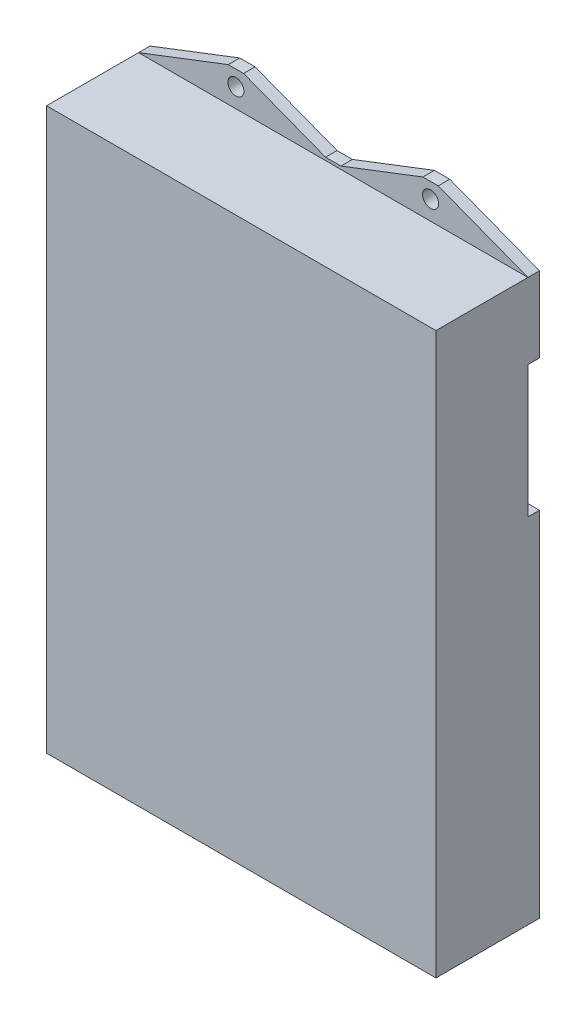
ISO-10303-21;
HEADER;
FILE_DESCRIPTION(('STEP AP214'),'2;1');
FILE_NAME('part.step','',(''),(''),'','','');
FILE_SCHEMA(('AUTOMOTIVE_DESIGN { 1 0 10303 214 1 1 1 1 }'));
ENDSEC;
DATA;
#1=APPLICATION_CONTEXT('core data for automotive mechanical design processes');
#2=APPLICATION_PROTOCOL_DEFINITION('international standard','automotive_design',2000,#1);
#3=PRODUCT_CONTEXT('',#1,'mechanical');
#4=PRODUCT('Part','Part','',(#3));
#5=PRODUCT_RELATED_PRODUCT_CATEGORY('part','',(#4));
#6=PRODUCT_DEFINITION_FORMATION('','',#4);
#7=PRODUCT_DEFINITION_CONTEXT('part definition',#1,'design');
#8=PRODUCT_DEFINITION('design','',#6,#7);
#9=PRODUCT_DEFINITION_SHAPE('','',#8);
#10=(LENGTH_UNIT() NAMED_UNIT(*) SI_UNIT(.MILLI.,.METRE.));
#11=(NAMED_UNIT(*) PLANE_ANGLE_UNIT() SI_UNIT($,.RADIAN.));
#12=(NAMED_UNIT(*) SI_UNIT($,.STERADIAN.) SOLID_ANGLE_UNIT());
#13=UNCERTAINTY_MEASURE_WITH_UNIT(LENGTH_MEASURE(1.E-05),#10,'distance_accuracy_value','');
#14=(GEOMETRIC_REPRESENTATION_CONTEXT(3) GLOBAL_UNCERTAINTY_ASSIGNED_CONTEXT((#13)) GLOBAL_UNIT_ASSIGNED_CONTEXT((#10,
#11,#12)) REPRESENTATION_CONTEXT('',''));
#15=CARTESIAN_POINT('',(0.,0.,0.));
#16=DIRECTION('',(0.,0.,1.));
#17=DIRECTION('',(1.,0.,0.));
#18=AXIS2_PLACEMENT_3D('',#15,#16,#17);
#19=CARTESIAN_POINT('',(0.,0.,3.));
#20=DIRECTION('',(0.,0.,1.));
#21=DIRECTION('',(1.,0.,0.));
#22=AXIS2_PLACEMENT_3D('',#19,#20,#21);
#23=PLANE('',#22);
#24=CARTESIAN_POINT('',(25.4,-78.15,3.));
#25=DIRECTION('',(0.,0.,1.));
#26=DIRECTION('',(-1.,0.,0.));
#27=AXIS2_PLACEMENT_3D('',#24,#25,#26);
#28=CIRCLE('',#27,2.1);
#29=CARTESIAN_POINT('',(23.3,-78.15,3.));
#30=VERTEX_POINT('',#29);
#31=EDGE_CURVE('E497',#30,#30,#28,.T.);
#32=ORIENTED_EDGE('',*,*,#31,.F.);
#33=EDGE_LOOP('',(#32));
#34=FACE_BOUND('',#33,.T.);
#35=CARTESIAN_POINT('',(-25.4,-78.15,3.));
#36=DIRECTION('',(0.,0.,1.));
#37=DIRECTION('',(1.,0.,0.));
#38=AXIS2_PLACEMENT_3D('',#35,#36,#37);
#39=CIRCLE('',#38,2.1);
#40=CARTESIAN_POINT('',(-23.3,-78.15,3.));
#41=VERTEX_POINT('',#40);
#42=EDGE_CURVE('E244',#41,#41,#39,.T.);
#43=ORIENTED_EDGE('',*,*,#42,.F.);
#44=EDGE_LOOP('',(#43));
#45=FACE_BOUND('',#44,.T.);
#46=DIRECTION('',(0.93334560620306,0.358979079308869,0.));
#47=VECTOR('',#46,1.);
#48=CARTESIAN_POINT('',(50.8,-73.15,3.));
#49=LINE('',#48,#47);
#50=CARTESIAN_POINT('',(27.4,-82.15,3.));
#51=VERTEX_POINT('',#50);
#52=CARTESIAN_POINT('',(50.8,-73.15,3.));
#53=VERTEX_POINT('',#52);
#54=EDGE_CURVE('E536',#51,#53,#49,.T.);
#55=ORIENTED_EDGE('',*,*,#54,.T.);
#56=DIRECTION('',(1.,0.,0.));
#57=VECTOR('',#56,1.);
#58=CARTESIAN_POINT('',(-50.8,-73.15,3.));
#59=LINE('',#58,#57);
#60=CARTESIAN_POINT('',(-50.8,-73.15,3.));
#61=VERTEX_POINT('',#60);
#62=EDGE_CURVE('E414',#61,#53,#59,.T.);
#63=ORIENTED_EDGE('',*,*,#62,.F.);
#64=DIRECTION('',(0.93334560620306,-0.358979079308869,0.));
#65=VECTOR('',#64,1.);
#66=CARTESIAN_POINT('',(-50.8,-73.15,3.));
#67=LINE('',#66,#65);
#68=CARTESIAN_POINT('',(-27.4,-82.15,3.));
#69=VERTEX_POINT('',#68);
#70=EDGE_CURVE('E518',#61,#69,#67,.T.);
#71=ORIENTED_EDGE('',*,*,#70,.T.);
#72=DIRECTION('',(1.,0.,0.));
#73=VECTOR('',#72,1.);
#74=CARTESIAN_POINT('',(-27.4,-82.15,3.));
#75=LINE('',#74,#73);
#76=CARTESIAN_POINT('',(-23.4,-82.15,3.));
#77=VERTEX_POINT('',#76);
#78=EDGE_CURVE('E521',#69,#77,#75,.T.);
#79=ORIENTED_EDGE('',*,*,#78,.T.);
#80=DIRECTION('',(0.933345606203059,0.35897907930887,0.));
#81=VECTOR('',#80,1.);
#82=CARTESIAN_POINT('',(-23.4,-82.15,3.));
#83=LINE('',#82,#81);
#84=CARTESIAN_POINT('',(-2.,-73.9192307692308,3.));
#85=VERTEX_POINT('',#84);
#86=EDGE_CURVE('E524',#77,#85,#83,.T.);
#87=ORIENTED_EDGE('',*,*,#86,.T.);
#88=DIRECTION('',(1.,0.,0.));
#89=VECTOR('',#88,1.);
#90=CARTESIAN_POINT('',(-2.,-73.9192307692308,3.));
#91=LINE('',#90,#89);
#92=CARTESIAN_POINT('',(2.,-73.9192307692308,3.));
#93=VERTEX_POINT('',#92);
#94=EDGE_CURVE('E527',#85,#93,#91,.T.);
#95=ORIENTED_EDGE('',*,*,#94,.T.);
#96=DIRECTION('',(0.933345606203059,-0.35897907930887,0.));
#97=VECTOR('',#96,1.);
#98=CARTESIAN_POINT('',(23.4,-82.15,3.));
#99=LINE('',#98,#97);
#100=CARTESIAN_POINT('',(23.4,-82.15,3.));
#101=VERTEX_POINT('',#100);
#102=EDGE_CURVE('E530',#93,#101,#99,.T.);
#103=ORIENTED_EDGE('',*,*,#102,.T.);
#104=DIRECTION('',(1.,0.,0.));
#105=VECTOR('',#104,1.);
#106=CARTESIAN_POINT('',(27.4,-82.15,3.));
#107=LINE('',#106,#105);
#108=EDGE_CURVE('E533',#101,#51,#107,.T.);
#109=ORIENTED_EDGE('',*,*,#108,.T.);
#110=EDGE_LOOP('',(#55,#63,#71,#79,#87,#95,#103,#109));
#111=FACE_BOUND('',#110,.T.);
#112=ADVANCED_FACE('F39',(#34,#45,#111),#23,.T.);
#113=CARTESIAN_POINT('',(25.4,78.15,3.));
#114=DIRECTION('',(0.,0.,1.));
#115=DIRECTION('',(1.,0.,0.));
#116=AXIS2_PLACEMENT_3D('',#113,#114,#115);
#117=CIRCLE('',#116,2.1);
#118=CARTESIAN_POINT('',(27.5,78.15,3.));
#119=VERTEX_POINT('',#118);
#120=EDGE_CURVE('E481',#119,#119,#117,.T.);
#121=ORIENTED_EDGE('',*,*,#120,.F.);
#122=EDGE_LOOP('',(#121));
#123=FACE_BOUND('',#122,.T.);
#124=CARTESIAN_POINT('',(-25.4,78.15,3.));
#125=DIRECTION('',(0.,0.,1.));
#126=DIRECTION('',(-1.,0.,0.));
#127=AXIS2_PLACEMENT_3D('',#124,#125,#126);
#128=CIRCLE('',#127,2.1);
#129=CARTESIAN_POINT('',(-27.5,78.15,3.));
#130=VERTEX_POINT('',#129);
#131=EDGE_CURVE('E489',#130,#130,#128,.T.);
#132=ORIENTED_EDGE('',*,*,#131,.F.);
#133=EDGE_LOOP('',(#132));
#134=FACE_BOUND('',#133,.T.);
#135=DIRECTION('',(-0.93334560620306,-0.358979079308869,0.));
#136=VECTOR('',#135,1.);
#137=CARTESIAN_POINT('',(-50.8,73.15,3.));
#138=LINE('',#137,#136);
#139=CARTESIAN_POINT('',(-27.4,82.15,3.));
#140=VERTEX_POINT('',#139);
#141=CARTESIAN_POINT('',(-50.8,73.15,3.));
#142=VERTEX_POINT('',#141);
#143=EDGE_CURVE('E57',#140,#142,#138,.T.);
#144=ORIENTED_EDGE('',*,*,#143,.T.);
#145=DIRECTION('',(-1.,0.,0.));
#146=VECTOR('',#145,1.);
#147=CARTESIAN_POINT('',(-50.8,73.15,3.));
#148=LINE('',#147,#146);
#149=CARTESIAN_POINT('',(50.8,73.15,3.));
#150=VERTEX_POINT('',#149);
#151=EDGE_CURVE('E427',#150,#142,#148,.T.);
#152=ORIENTED_EDGE('',*,*,#151,.F.);
#153=DIRECTION('',(-0.93334560620306,0.358979079308869,0.));
#154=VECTOR('',#153,1.);
#155=CARTESIAN_POINT('',(50.8,73.15,3.));
#156=LINE('',#155,#154);
#157=CARTESIAN_POINT('',(27.4,82.15,3.));
#158=VERTEX_POINT('',#157);
#159=EDGE_CURVE('E551',#150,#158,#156,.T.);
#160=ORIENTED_EDGE('',*,*,#159,.T.);
#161=DIRECTION('',(-1.,0.,0.));
#162=VECTOR('',#161,1.);
#163=CARTESIAN_POINT('',(27.4,82.15,3.));
#164=LINE('',#163,#162);
#165=CARTESIAN_POINT('',(23.4,82.15,3.));
#166=VERTEX_POINT('',#165);
#167=EDGE_CURVE('E554',#158,#166,#164,.T.);
#168=ORIENTED_EDGE('',*,*,#167,.T.);
#169=DIRECTION('',(-0.933345606203058,-0.358979079308872,0.));
#170=VECTOR('',#169,1.);
#171=CARTESIAN_POINT('',(23.4,82.15,3.));
#172=LINE('',#171,#170);
#173=CARTESIAN_POINT('',(2.,73.9192307692307,3.));
#174=VERTEX_POINT('',#173);
#175=EDGE_CURVE('E557',#166,#174,#172,.T.);
#176=ORIENTED_EDGE('',*,*,#175,.T.);
#177=DIRECTION('',(-1.,0.,0.));
#178=VECTOR('',#177,1.);
#179=CARTESIAN_POINT('',(-1.99999999999982,73.9192307692307,3.));
#180=LINE('',#179,#178);
#181=CARTESIAN_POINT('',(-1.99999999999982,73.9192307692307,3.));
#182=VERTEX_POINT('',#181);
#183=EDGE_CURVE('E217',#174,#182,#180,.T.);
#184=ORIENTED_EDGE('',*,*,#183,.T.);
#185=DIRECTION('',(-0.93334560620306,0.358979079308869,0.));
#186=VECTOR('',#185,1.);
#187=CARTESIAN_POINT('',(-23.4,82.15,3.));
#188=LINE('',#187,#186);
#189=CARTESIAN_POINT('',(-23.4,82.15,3.));
#190=VERTEX_POINT('',#189);
#191=EDGE_CURVE('E211',#182,#190,#188,.T.);
#192=ORIENTED_EDGE('',*,*,#191,.T.);
#193=DIRECTION('',(-1.,0.,0.));
#194=VECTOR('',#193,1.);
#195=CARTESIAN_POINT('',(-27.4,82.15,3.));
#196=LINE('',#195,#194);
#197=EDGE_CURVE('E215',#190,#140,#196,.T.);
#198=ORIENTED_EDGE('',*,*,#197,.T.);
#199=EDGE_LOOP('',(#144,#152,#160,#168,#176,#184,#192,#198));
#200=FACE_BOUND('',#199,.T.);
#201=ADVANCED_FACE('F213',(#123,#134,#200),#23,.T.);
#202=CARTESIAN_POINT('',(0.,0.,0.));
#203=DIRECTION('',(0.,0.,1.));
#204=DIRECTION('',(1.,0.,0.));
#205=AXIS2_PLACEMENT_3D('',#202,#203,#204);
#206=PLANE('',#205);
#207=DIRECTION('',(0.,-1.,0.));
#208=VECTOR('',#207,1.);
#209=CARTESIAN_POINT('',(-50.8,73.15,0.));
#210=LINE('',#209,#208);
#211=CARTESIAN_POINT('',(-50.8,73.15,0.));
#212=VERTEX_POINT('',#211);
#213=CARTESIAN_POINT('',(-50.8,53.45,0.));
#214=VERTEX_POINT('',#213);
#215=EDGE_CURVE('E239',#212,#214,#210,.T.);
#216=ORIENTED_EDGE('',*,*,#215,.F.);
#217=DIRECTION('',(-0.93334560620306,-0.358979079308869,0.));
#218=VECTOR('',#217,1.);
#219=CARTESIAN_POINT('',(-50.8,73.15,0.));
#220=LINE('',#219,#218);
#221=CARTESIAN_POINT('',(-27.4,82.15,0.));
#222=VERTEX_POINT('',#221);
#223=EDGE_CURVE('E141',#222,#212,#220,.T.);
#224=ORIENTED_EDGE('',*,*,#223,.F.);
#225=DIRECTION('',(-1.,0.,0.));
#226=VECTOR('',#225,1.);
#227=CARTESIAN_POINT('',(-27.4,82.15,0.));
#228=LINE('',#227,#226);
#229=CARTESIAN_POINT('',(-23.4,82.15,0.));
#230=VERTEX_POINT('',#229);
#231=EDGE_CURVE('E135',#230,#222,#228,.T.);
#232=ORIENTED_EDGE('',*,*,#231,.F.);
#233=DIRECTION('',(-0.93334560620306,0.358979079308869,0.));
#234=VECTOR('',#233,1.);
#235=CARTESIAN_POINT('',(-23.4,82.15,0.));
#236=LINE('',#235,#234);
#237=CARTESIAN_POINT('',(-1.99999999999982,73.9192307692307,0.));
#238=VERTEX_POINT('',#237);
#239=EDGE_CURVE('E226',#238,#230,#236,.T.);
#240=ORIENTED_EDGE('',*,*,#239,.F.);
#241=DIRECTION('',(-1.,0.,0.));
#242=VECTOR('',#241,1.);
#243=CARTESIAN_POINT('',(-1.99999999999982,73.9192307692307,0.));
#244=LINE('',#243,#242);
#245=CARTESIAN_POINT('',(2.,73.9192307692307,0.));
#246=VERTEX_POINT('',#245);
#247=EDGE_CURVE('E301',#246,#238,#244,.T.);
#248=ORIENTED_EDGE('',*,*,#247,.F.);
#249=DIRECTION('',(-0.933345606203058,-0.358979079308872,0.));
#250=VECTOR('',#249,1.);
#251=CARTESIAN_POINT('',(23.4,82.15,0.));
#252=LINE('',#251,#250);
#253=CARTESIAN_POINT('',(23.4,82.15,0.));
#254=VERTEX_POINT('',#253);
#255=EDGE_CURVE('E298',#254,#246,#252,.T.);
#256=ORIENTED_EDGE('',*,*,#255,.F.);
#257=DIRECTION('',(-1.,0.,0.));
#258=VECTOR('',#257,1.);
#259=CARTESIAN_POINT('',(27.4,82.15,0.));
#260=LINE('',#259,#258);
#261=CARTESIAN_POINT('',(27.4,82.15,0.));
#262=VERTEX_POINT('',#261);
#263=EDGE_CURVE('E295',#262,#254,#260,.T.);
#264=ORIENTED_EDGE('',*,*,#263,.F.);
#265=DIRECTION('',(-0.93334560620306,0.358979079308869,0.));
#266=VECTOR('',#265,1.);
#267=CARTESIAN_POINT('',(50.8,73.15,0.));
#268=LINE('',#267,#266);
#269=CARTESIAN_POINT('',(50.8,73.15,0.));
#270=VERTEX_POINT('',#269);
#271=EDGE_CURVE('E292',#270,#262,#268,.T.);
#272=ORIENTED_EDGE('',*,*,#271,.F.);
#273=DIRECTION('',(0.,1.,0.));
#274=VECTOR('',#273,1.);
#275=CARTESIAN_POINT('',(50.8,73.15,0.));
#276=LINE('',#275,#274);
#277=CARTESIAN_POINT('',(50.8,53.45,0.));
#278=VERTEX_POINT('',#277);
#279=EDGE_CURVE('E289',#278,#270,#276,.T.);
#280=ORIENTED_EDGE('',*,*,#279,.F.);
#281=DIRECTION('',(1.,0.,0.));
#282=VECTOR('',#281,1.);
#283=CARTESIAN_POINT('',(50.8,53.45,0.));
#284=LINE('',#283,#282);
#285=CARTESIAN_POINT('',(43.2,53.45,0.));
#286=VERTEX_POINT('',#285);
#287=EDGE_CURVE('E286',#286,#278,#284,.T.);
#288=ORIENTED_EDGE('',*,*,#287,.F.);
#289=DIRECTION('',(0.,1.,0.));
#290=VECTOR('',#289,1.);
#291=CARTESIAN_POINT('',(43.2,53.45,0.));
#292=LINE('',#291,#290);
#293=CARTESIAN_POINT('',(43.2,19.05,0.));
#294=VERTEX_POINT('',#293);
#295=EDGE_CURVE('E283',#294,#286,#292,.T.);
#296=ORIENTED_EDGE('',*,*,#295,.F.);
#297=DIRECTION('',(-1.,0.,0.));
#298=VECTOR('',#297,1.);
#299=CARTESIAN_POINT('',(43.2,19.05,0.));
#300=LINE('',#299,#298);
#301=CARTESIAN_POINT('',(50.8,19.05,0.));
#302=VERTEX_POINT('',#301);
#303=EDGE_CURVE('E280',#302,#294,#300,.T.);
#304=ORIENTED_EDGE('',*,*,#303,.F.);
#305=DIRECTION('',(0.,1.,0.));
#306=VECTOR('',#305,1.);
#307=CARTESIAN_POINT('',(50.8,19.05,0.));
#308=LINE('',#307,#306);
#309=CARTESIAN_POINT('',(50.8,-73.15,0.));
#310=VERTEX_POINT('',#309);
#311=EDGE_CURVE('E277',#310,#302,#308,.T.);
#312=ORIENTED_EDGE('',*,*,#311,.F.);
#313=DIRECTION('',(0.93334560620306,0.358979079308869,0.));
#314=VECTOR('',#313,1.);
#315=CARTESIAN_POINT('',(50.8,-73.15,0.));
#316=LINE('',#315,#314);
#317=CARTESIAN_POINT('',(27.4,-82.15,0.));
#318=VERTEX_POINT('',#317);
#319=EDGE_CURVE('E274',#318,#310,#316,.T.);
#320=ORIENTED_EDGE('',*,*,#319,.F.);
#321=DIRECTION('',(1.,0.,0.));
#322=VECTOR('',#321,1.);
#323=CARTESIAN_POINT('',(27.4,-82.15,0.));
#324=LINE('',#323,#322);
#325=CARTESIAN_POINT('',(23.4,-82.15,0.));
#326=VERTEX_POINT('',#325);
#327=EDGE_CURVE('E271',#326,#318,#324,.T.);
#328=ORIENTED_EDGE('',*,*,#327,.F.);
#329=DIRECTION('',(0.933345606203059,-0.35897907930887,0.));
#330=VECTOR('',#329,1.);
#331=CARTESIAN_POINT('',(23.4,-82.15,0.));
#332=LINE('',#331,#330);
#333=CARTESIAN_POINT('',(2.,-73.9192307692308,0.));
#334=VERTEX_POINT('',#333);
#335=EDGE_CURVE('E268',#334,#326,#332,.T.);
#336=ORIENTED_EDGE('',*,*,#335,.F.);
#337=DIRECTION('',(1.,0.,0.));
#338=VECTOR('',#337,1.);
#339=CARTESIAN_POINT('',(-2.,-73.9192307692308,0.));
#340=LINE('',#339,#338);
#341=CARTESIAN_POINT('',(-2.,-73.9192307692308,0.));
#342=VERTEX_POINT('',#341);
#343=EDGE_CURVE('E265',#342,#334,#340,.T.);
#344=ORIENTED_EDGE('',*,*,#343,.F.);
#345=DIRECTION('',(0.933345606203059,0.35897907930887,0.));
#346=VECTOR('',#345,1.);
#347=CARTESIAN_POINT('',(-23.4,-82.15,0.));
#348=LINE('',#347,#346);
#349=CARTESIAN_POINT('',(-23.4,-82.15,0.));
#350=VERTEX_POINT('',#349);
#351=EDGE_CURVE('E262',#350,#342,#348,.T.);
#352=ORIENTED_EDGE('',*,*,#351,.F.);
#353=DIRECTION('',(1.,0.,0.));
#354=VECTOR('',#353,1.);
#355=CARTESIAN_POINT('',(-27.4,-82.15,0.));
#356=LINE('',#355,#354);
#357=CARTESIAN_POINT('',(-27.4,-82.15,0.));
#358=VERTEX_POINT('',#357);
#359=EDGE_CURVE('E259',#358,#350,#356,.T.);
#360=ORIENTED_EDGE('',*,*,#359,.F.);
#361=DIRECTION('',(0.93334560620306,-0.358979079308869,0.));
#362=VECTOR('',#361,1.);
#363=CARTESIAN_POINT('',(-50.8,-73.15,0.));
#364=LINE('',#363,#362);
#365=CARTESIAN_POINT('',(-50.8,-73.15,0.));
#366=VERTEX_POINT('',#365);
#367=EDGE_CURVE('E256',#366,#358,#364,.T.);
#368=ORIENTED_EDGE('',*,*,#367,.F.);
#369=DIRECTION('',(0.,-1.,0.));
#370=VECTOR('',#369,1.);
#371=CARTESIAN_POINT('',(-50.8,19.05,0.));
#372=LINE('',#371,#370);
#373=CARTESIAN_POINT('',(-50.8,19.05,0.));
#374=VERTEX_POINT('',#373);
#375=EDGE_CURVE('E253',#374,#366,#372,.T.);
#376=ORIENTED_EDGE('',*,*,#375,.F.);
#377=DIRECTION('',(-1.,0.,0.));
#378=VECTOR('',#377,1.);
#379=CARTESIAN_POINT('',(-50.8,19.05,0.));
#380=LINE('',#379,#378);
#381=CARTESIAN_POINT('',(-43.2,19.05,0.));
#382=VERTEX_POINT('',#381);
#383=EDGE_CURVE('E250',#382,#374,#380,.T.);
#384=ORIENTED_EDGE('',*,*,#383,.F.);
#385=DIRECTION('',(0.,-1.,0.));
#386=VECTOR('',#385,1.);
#387=CARTESIAN_POINT('',(-43.2,53.45,0.));
#388=LINE('',#387,#386);
#389=CARTESIAN_POINT('',(-43.2,53.45,0.));
#390=VERTEX_POINT('',#389);
#391=EDGE_CURVE('E247',#390,#382,#388,.T.);
#392=ORIENTED_EDGE('',*,*,#391,.F.);
#393=DIRECTION('',(1.,0.,0.));
#394=VECTOR('',#393,1.);
#395=CARTESIAN_POINT('',(-50.8,53.45,0.));
#396=LINE('',#395,#394);
#397=EDGE_CURVE('E243',#214,#390,#396,.T.);
#398=ORIENTED_EDGE('',*,*,#397,.F.);
#399=EDGE_LOOP('',(#216,#224,#232,#240,#248,#256,#264,#272,#280,#288,#296,#304,#312,#320,#328,
#336,#344,#352,#360,#368,#376,#384,#392,#398));
#400=FACE_BOUND('',#399,.T.);
#401=CARTESIAN_POINT('',(-25.4,-78.15,0.));
#402=DIRECTION('',(0.,0.,1.));
#403=DIRECTION('',(1.,0.,0.));
#404=AXIS2_PLACEMENT_3D('',#401,#402,#403);
#405=CIRCLE('',#404,2.1);
#406=CARTESIAN_POINT('',(-23.3,-78.15,0.));
#407=VERTEX_POINT('',#406);
#408=EDGE_CURVE('E501',#407,#407,#405,.T.);
#409=ORIENTED_EDGE('',*,*,#408,.T.);
#410=EDGE_LOOP('',(#409));
#411=FACE_BOUND('',#410,.T.);
#412=CARTESIAN_POINT('',(25.4,-78.15,0.));
#413=DIRECTION('',(0.,0.,1.));
#414=DIRECTION('',(-1.,0.,0.));
#415=AXIS2_PLACEMENT_3D('',#412,#413,#414);
#416=CIRCLE('',#415,2.1);
#417=CARTESIAN_POINT('',(23.3,-78.15,0.));
#418=VERTEX_POINT('',#417);
#419=EDGE_CURVE('E493',#418,#418,#416,.T.);
#420=ORIENTED_EDGE('',*,*,#419,.T.);
#421=EDGE_LOOP('',(#420));
#422=FACE_BOUND('',#421,.T.);
#423=CARTESIAN_POINT('',(-25.4,78.15,0.));
#424=DIRECTION('',(0.,0.,1.));
#425=DIRECTION('',(-1.,0.,0.));
#426=AXIS2_PLACEMENT_3D('',#423,#424,#425);
#427=CIRCLE('',#426,2.1);
#428=CARTESIAN_POINT('',(-27.5,78.15,0.));
#429=VERTEX_POINT('',#428);
#430=EDGE_CURVE('E485',#429,#429,#427,.T.);
#431=ORIENTED_EDGE('',*,*,#430,.T.);
#432=EDGE_LOOP('',(#431));
#433=FACE_BOUND('',#432,.T.);
#434=CARTESIAN_POINT('',(25.4,78.15,0.));
#435=DIRECTION('',(0.,0.,1.));
#436=DIRECTION('',(1.,0.,0.));
#437=AXIS2_PLACEMENT_3D('',#434,#435,#436);
#438=CIRCLE('',#437,2.1);
#439=CARTESIAN_POINT('',(27.5,78.15,0.));
#440=VERTEX_POINT('',#439);
#441=EDGE_CURVE('E480',#440,#440,#438,.T.);
#442=ORIENTED_EDGE('',*,*,#441,.T.);
#443=EDGE_LOOP('',(#442));
#444=FACE_BOUND('',#443,.T.);
#445=CARTESIAN_POINT('',(-48.1,-69.85,0.));
#446=DIRECTION('',(0.,0.,1.));
#447=DIRECTION('',(1.,0.,0.));
#448=AXIS2_PLACEMENT_3D('',#445,#446,#447);
#449=CIRCLE('',#448,1.5);
#450=CARTESIAN_POINT('',(-46.6,-69.85,0.));
#451=VERTEX_POINT('',#450);
#452=EDGE_CURVE('E476',#451,#451,#449,.T.);
#453=ORIENTED_EDGE('',*,*,#452,.T.);
#454=EDGE_LOOP('',(#453));
#455=FACE_BOUND('',#454,.T.);
#456=CARTESIAN_POINT('',(48.1,-69.85,0.));
#457=DIRECTION('',(0.,0.,1.));
#458=DIRECTION('',(-1.,0.,0.));
#459=AXIS2_PLACEMENT_3D('',#456,#457,#458);
#460=CIRCLE('',#459,1.5);
#461=CARTESIAN_POINT('',(46.6,-69.85,0.));
#462=VERTEX_POINT('',#461);
#463=EDGE_CURVE('E472',#462,#462,#460,.T.);
#464=ORIENTED_EDGE('',*,*,#463,.T.);
#465=EDGE_LOOP('',(#464));
#466=FACE_BOUND('',#465,.T.);
#467=CARTESIAN_POINT('',(-48.1,69.85,0.));
#468=DIRECTION('',(0.,0.,1.));
#469=DIRECTION('',(-1.,0.,0.));
#470=AXIS2_PLACEMENT_3D('',#467,#468,#469);
#471=CIRCLE('',#470,1.5);
#472=CARTESIAN_POINT('',(-49.6,69.85,0.));
#473=VERTEX_POINT('',#472);
#474=EDGE_CURVE('E468',#473,#473,#471,.T.);
#475=ORIENTED_EDGE('',*,*,#474,.T.);
#476=EDGE_LOOP('',(#475));
#477=FACE_BOUND('',#476,.T.);
#478=CARTESIAN_POINT('',(48.1,69.85,0.));
#479=DIRECTION('',(0.,0.,1.));
#480=DIRECTION('',(1.,0.,0.));
#481=AXIS2_PLACEMENT_3D('',#478,#479,#480);
#482=CIRCLE('',#481,1.5);
#483=CARTESIAN_POINT('',(49.6,69.85,0.));
#484=VERTEX_POINT('',#483);
#485=EDGE_CURVE('E464',#484,#484,#482,.T.);
#486=ORIENTED_EDGE('',*,*,#485,.T.);
#487=EDGE_LOOP('',(#486));
#488=FACE_BOUND('',#487,.T.);
#489=ADVANCED_FACE('F398',(#400,#411,#422,#433,#444,#455,#466,#477,#488),#206,.F.);
#490=CARTESIAN_POINT('',(-50.8,53.45,3.));
#491=DIRECTION('',(0.,1.,0.));
#492=DIRECTION('',(0.,0.,1.));
#493=AXIS2_PLACEMENT_3D('',#490,#491,#492);
#494=PLANE('',#493);
#495=ORIENTED_EDGE('',*,*,#397,.T.);
#496=DIRECTION('',(0.,0.,-1.));
#497=VECTOR('',#496,1.);
#498=CARTESIAN_POINT('',(-43.2,53.45,3.));
#499=LINE('',#498,#497);
#500=CARTESIAN_POINT('',(-43.2,53.45,3.));
#501=VERTEX_POINT('',#500);
#502=EDGE_CURVE('E49',#501,#390,#499,.T.);
#503=ORIENTED_EDGE('',*,*,#502,.F.);
#504=DIRECTION('',(1.,0.,0.));
#505=VECTOR('',#504,1.);
#506=CARTESIAN_POINT('',(-50.8,53.45,3.));
#507=LINE('',#506,#505);
#508=CARTESIAN_POINT('',(-50.8,53.45,3.));
#509=VERTEX_POINT('',#508);
#510=EDGE_CURVE('E149',#509,#501,#507,.T.);
#511=ORIENTED_EDGE('',*,*,#510,.F.);
#512=DIRECTION('',(0.,0.,-1.));
#513=VECTOR('',#512,1.);
#514=CARTESIAN_POINT('',(-50.8,53.45,3.));
#515=LINE('',#514,#513);
#516=EDGE_CURVE('E11',#509,#214,#515,.T.);
#517=ORIENTED_EDGE('',*,*,#516,.T.);
#518=EDGE_LOOP('',(#495,#503,#511,#517));
#519=FACE_BOUND('',#518,.T.);
#520=ADVANCED_FACE('F41',(#519),#494,.F.);
#521=CARTESIAN_POINT('',(-43.2,53.45,3.));
#522=DIRECTION('',(1.,0.,0.));
#523=DIRECTION('',(0.,1.,0.));
#524=AXIS2_PLACEMENT_3D('',#521,#522,#523);
#525=PLANE('',#524);
#526=ORIENTED_EDGE('',*,*,#391,.T.);
#527=DIRECTION('',(0.,0.,-1.));
#528=VECTOR('',#527,1.);
#529=CARTESIAN_POINT('',(-43.2,19.05,3.));
#530=LINE('',#529,#528);
#531=CARTESIAN_POINT('',(-43.2,19.05,3.));
#532=VERTEX_POINT('',#531);
#533=EDGE_CURVE('E384',#532,#382,#530,.T.);
#534=ORIENTED_EDGE('',*,*,#533,.F.);
#535=DIRECTION('',(0.,-1.,0.));
#536=VECTOR('',#535,1.);
#537=CARTESIAN_POINT('',(-43.2,53.45,3.));
#538=LINE('',#537,#536);
#539=EDGE_CURVE('E394',#501,#532,#538,.T.);
#540=ORIENTED_EDGE('',*,*,#539,.F.);
#541=ORIENTED_EDGE('',*,*,#502,.T.);
#542=EDGE_LOOP('',(#526,#534,#540,#541));
#543=FACE_BOUND('',#542,.T.);
#544=ADVANCED_FACE('F392',(#543),#525,.F.);
#545=CARTESIAN_POINT('',(-50.8,19.05,3.));
#546=DIRECTION('',(0.,-1.,0.));
#547=DIRECTION('',(0.,0.,-1.));
#548=AXIS2_PLACEMENT_3D('',#545,#546,#547);
#549=PLANE('',#548);
#550=ORIENTED_EDGE('',*,*,#383,.T.);
#551=DIRECTION('',(0.,0.,-1.));
#552=VECTOR('',#551,1.);
#553=CARTESIAN_POINT('',(-50.8,19.05,3.));
#554=LINE('',#553,#552);
#555=CARTESIAN_POINT('',(-50.8,19.05,3.));
#556=VERTEX_POINT('',#555);
#557=EDGE_CURVE('E380',#556,#374,#554,.T.);
#558=ORIENTED_EDGE('',*,*,#557,.F.);
#559=DIRECTION('',(-1.,0.,0.));
#560=VECTOR('',#559,1.);
#561=CARTESIAN_POINT('',(-50.8,19.05,3.));
#562=LINE('',#561,#560);
#563=EDGE_CURVE('E515',#532,#556,#562,.T.);
#564=ORIENTED_EDGE('',*,*,#563,.F.);
#565=ORIENTED_EDGE('',*,*,#533,.T.);
#566=EDGE_LOOP('',(#550,#558,#564,#565));
#567=FACE_BOUND('',#566,.T.);
#568=ADVANCED_FACE('F403',(#567),#549,.F.);
#569=CARTESIAN_POINT('',(-50.8,19.05,3.));
#570=DIRECTION('',(1.,0.,0.));
#571=DIRECTION('',(0.,0.,-1.));
#572=AXIS2_PLACEMENT_3D('',#569,#570,#571);
#573=PLANE('',#572);
#574=ORIENTED_EDGE('',*,*,#375,.T.);
#575=DIRECTION('',(0.,0.,-1.));
#576=VECTOR('',#575,1.);
#577=CARTESIAN_POINT('',(-50.8,-73.15,3.));
#578=LINE('',#577,#576);
#579=EDGE_CURVE('E376',#61,#366,#578,.T.);
#580=ORIENTED_EDGE('',*,*,#579,.F.);
#581=DIRECTION('',(0.,0.,-1.));
#582=VECTOR('',#581,1.);
#583=CARTESIAN_POINT('',(-50.8,-73.15,27.));
#584=LINE('',#583,#582);
#585=CARTESIAN_POINT('',(-50.8,-73.15,27.));
#586=VERTEX_POINT('',#585);
#587=EDGE_CURVE('E444',#586,#61,#584,.T.);
#588=ORIENTED_EDGE('',*,*,#587,.F.);
#589=DIRECTION('',(0.,-1.,0.));
#590=VECTOR('',#589,1.);
#591=CARTESIAN_POINT('',(-50.8,73.15,27.));
#592=LINE('',#591,#590);
#593=CARTESIAN_POINT('',(-50.8,73.15,27.));
#594=VERTEX_POINT('',#593);
#595=EDGE_CURVE('E431',#594,#586,#592,.T.);
#596=ORIENTED_EDGE('',*,*,#595,.F.);
#597=DIRECTION('',(0.,0.,-1.));
#598=VECTOR('',#597,1.);
#599=CARTESIAN_POINT('',(-50.8,73.15,27.));
#600=LINE('',#599,#598);
#601=EDGE_CURVE('E432',#594,#142,#600,.T.);
#602=ORIENTED_EDGE('',*,*,#601,.T.);
#603=DIRECTION('',(0.,0.,-1.));
#604=VECTOR('',#603,1.);
#605=CARTESIAN_POINT('',(-50.8,73.15,3.));
#606=LINE('',#605,#604);
#607=EDGE_CURVE('E235',#142,#212,#606,.T.);
#608=ORIENTED_EDGE('',*,*,#607,.T.);
#609=ORIENTED_EDGE('',*,*,#215,.T.);
#610=ORIENTED_EDGE('',*,*,#516,.F.);
#611=DIRECTION('',(0.,-1.,0.));
#612=VECTOR('',#611,1.);
#613=CARTESIAN_POINT('',(-50.8,73.15,3.));
#614=LINE('',#613,#612);
#615=EDGE_CURVE('E411',#509,#556,#614,.T.);
#616=ORIENTED_EDGE('',*,*,#615,.T.);
#617=ORIENTED_EDGE('',*,*,#557,.T.);
#618=EDGE_LOOP('',(#574,#580,#588,#596,#602,#608,#609,#610,#616,#617));
#619=FACE_BOUND('',#618,.T.);
#620=ADVANCED_FACE('F408',(#619),#573,.F.);
#621=CARTESIAN_POINT('',(-50.8,-73.15,3.));
#622=DIRECTION('',(0.358979079308869,0.93334560620306,0.));
#623=DIRECTION('',(-0.93334560620306,0.358979079308869,0.));
#624=AXIS2_PLACEMENT_3D('',#621,#622,#623);
#625=PLANE('',#624);
#626=ORIENTED_EDGE('',*,*,#367,.T.);
#627=DIRECTION('',(0.,0.,-1.));
#628=VECTOR('',#627,1.);
#629=CARTESIAN_POINT('',(-27.4,-82.15,3.));
#630=LINE('',#629,#628);
#631=EDGE_CURVE('E372',#69,#358,#630,.T.);
#632=ORIENTED_EDGE('',*,*,#631,.F.);
#633=ORIENTED_EDGE('',*,*,#70,.F.);
#634=ORIENTED_EDGE('',*,*,#579,.T.);
#635=EDGE_LOOP('',(#626,#632,#633,#634));
#636=FACE_BOUND('',#635,.T.);
#637=ADVANCED_FACE('F752',(#636),#625,.F.);
#638=CARTESIAN_POINT('',(-27.4,-82.15,3.));
#639=DIRECTION('',(0.,1.,0.));
#640=DIRECTION('',(0.,0.,1.));
#641=AXIS2_PLACEMENT_3D('',#638,#639,#640);
#642=PLANE('',#641);
#643=ORIENTED_EDGE('',*,*,#359,.T.);
#644=DIRECTION('',(0.,0.,-1.));
#645=VECTOR('',#644,1.);
#646=CARTESIAN_POINT('',(-23.4,-82.15,3.));
#647=LINE('',#646,#645);
#648=EDGE_CURVE('E368',#77,#350,#647,.T.);
#649=ORIENTED_EDGE('',*,*,#648,.F.);
#650=ORIENTED_EDGE('',*,*,#78,.F.);
#651=ORIENTED_EDGE('',*,*,#631,.T.);
#652=EDGE_LOOP('',(#643,#649,#650,#651));
#653=FACE_BOUND('',#652,.T.);
#654=ADVANCED_FACE('F861',(#653),#642,.F.);
#655=CARTESIAN_POINT('',(-23.4,-82.15,3.));
#656=DIRECTION('',(-0.35897907930887,0.933345606203059,0.));
#657=DIRECTION('',(-0.933345606203059,-0.35897907930887,0.));
#658=AXIS2_PLACEMENT_3D('',#655,#656,#657);
#659=PLANE('',#658);
#660=ORIENTED_EDGE('',*,*,#351,.T.);
#661=DIRECTION('',(0.,0.,-1.));
#662=VECTOR('',#661,1.);
#663=CARTESIAN_POINT('',(-2.,-73.9192307692308,3.));
#664=LINE('',#663,#662);
#665=EDGE_CURVE('E364',#85,#342,#664,.T.);
#666=ORIENTED_EDGE('',*,*,#665,.F.);
#667=ORIENTED_EDGE('',*,*,#86,.F.);
#668=ORIENTED_EDGE('',*,*,#648,.T.);
#669=EDGE_LOOP('',(#660,#666,#667,#668));
#670=FACE_BOUND('',#669,.T.);
#671=ADVANCED_FACE('F870',(#670),#659,.F.);
#672=CARTESIAN_POINT('',(-2.,-73.9192307692308,3.));
#673=DIRECTION('',(0.,1.,0.));
#674=DIRECTION('',(0.,0.,1.));
#675=AXIS2_PLACEMENT_3D('',#672,#673,#674);
#676=PLANE('',#675);
#677=ORIENTED_EDGE('',*,*,#343,.T.);
#678=DIRECTION('',(0.,0.,-1.));
#679=VECTOR('',#678,1.);
#680=CARTESIAN_POINT('',(2.,-73.9192307692308,3.));
#681=LINE('',#680,#679);
#682=EDGE_CURVE('E360',#93,#334,#681,.T.);
#683=ORIENTED_EDGE('',*,*,#682,.F.);
#684=ORIENTED_EDGE('',*,*,#94,.F.);
#685=ORIENTED_EDGE('',*,*,#665,.T.);
#686=EDGE_LOOP('',(#677,#683,#684,#685));
#687=FACE_BOUND('',#686,.T.);
#688=ADVANCED_FACE('F880',(#687),#676,.F.);
#689=CARTESIAN_POINT('',(23.4,-82.15,3.));
#690=DIRECTION('',(0.35897907930887,0.933345606203059,0.));
#691=DIRECTION('',(-0.933345606203059,0.35897907930887,0.));
#692=AXIS2_PLACEMENT_3D('',#689,#690,#691);
#693=PLANE('',#692);
#694=ORIENTED_EDGE('',*,*,#335,.T.);
#695=DIRECTION('',(0.,0.,-1.));
#696=VECTOR('',#695,1.);
#697=CARTESIAN_POINT('',(23.4,-82.15,3.));
#698=LINE('',#697,#696);
#699=EDGE_CURVE('E356',#101,#326,#698,.T.);
#700=ORIENTED_EDGE('',*,*,#699,.F.);
#701=ORIENTED_EDGE('',*,*,#102,.F.);
#702=ORIENTED_EDGE('',*,*,#682,.T.);
#703=EDGE_LOOP('',(#694,#700,#701,#702));
#704=FACE_BOUND('',#703,.T.);
#705=ADVANCED_FACE('F889',(#704),#693,.F.);
#706=CARTESIAN_POINT('',(27.4,-82.15,3.));
#707=DIRECTION('',(0.,1.,0.));
#708=DIRECTION('',(0.,0.,1.));
#709=AXIS2_PLACEMENT_3D('',#706,#707,#708);
#710=PLANE('',#709);
#711=ORIENTED_EDGE('',*,*,#327,.T.);
#712=DIRECTION('',(0.,0.,-1.));
#713=VECTOR('',#712,1.);
#714=CARTESIAN_POINT('',(27.4,-82.15,3.));
#715=LINE('',#714,#713);
#716=EDGE_CURVE('E352',#51,#318,#715,.T.);
#717=ORIENTED_EDGE('',*,*,#716,.F.);
#718=ORIENTED_EDGE('',*,*,#108,.F.);
#719=ORIENTED_EDGE('',*,*,#699,.T.);
#720=EDGE_LOOP('',(#711,#717,#718,#719));
#721=FACE_BOUND('',#720,.T.);
#722=ADVANCED_FACE('F898',(#721),#710,.F.);
#723=CARTESIAN_POINT('',(50.8,-73.15,3.));
#724=DIRECTION('',(-0.358979079308869,0.93334560620306,0.));
#725=DIRECTION('',(-0.93334560620306,-0.358979079308869,0.));
#726=AXIS2_PLACEMENT_3D('',#723,#724,#725);
#727=PLANE('',#726);
#728=ORIENTED_EDGE('',*,*,#319,.T.);
#729=DIRECTION('',(0.,0.,-1.));
#730=VECTOR('',#729,1.);
#731=CARTESIAN_POINT('',(50.8,-73.15,3.));
#732=LINE('',#731,#730);
#733=EDGE_CURVE('E348',#53,#310,#732,.T.);
#734=ORIENTED_EDGE('',*,*,#733,.F.);
#735=ORIENTED_EDGE('',*,*,#54,.F.);
#736=ORIENTED_EDGE('',*,*,#716,.T.);
#737=EDGE_LOOP('',(#728,#734,#735,#736));
#738=FACE_BOUND('',#737,.T.);
#739=ADVANCED_FACE('F907',(#738),#727,.F.);
#740=CARTESIAN_POINT('',(43.2,19.05,3.));
#741=DIRECTION('',(0.,-1.,0.));
#742=DIRECTION('',(0.,0.,-1.));
#743=AXIS2_PLACEMENT_3D('',#740,#741,#742);
#744=PLANE('',#743);
#745=ORIENTED_EDGE('',*,*,#303,.T.);
#746=DIRECTION('',(0.,0.,-1.));
#747=VECTOR('',#746,1.);
#748=CARTESIAN_POINT('',(43.2,19.05,3.));
#749=LINE('',#748,#747);
#750=CARTESIAN_POINT('',(43.2,19.05,3.));
#751=VERTEX_POINT('',#750);
#752=EDGE_CURVE('E340',#751,#294,#749,.T.);
#753=ORIENTED_EDGE('',*,*,#752,.F.);
#754=DIRECTION('',(-1.,0.,0.));
#755=VECTOR('',#754,1.);
#756=CARTESIAN_POINT('',(43.2,19.05,3.));
#757=LINE('',#756,#755);
#758=CARTESIAN_POINT('',(50.8,19.05,3.));
#759=VERTEX_POINT('',#758);
#760=EDGE_CURVE('E539',#759,#751,#757,.T.);
#761=ORIENTED_EDGE('',*,*,#760,.F.);
#762=DIRECTION('',(0.,0.,-1.));
#763=VECTOR('',#762,1.);
#764=CARTESIAN_POINT('',(50.8,19.05,3.));
#765=LINE('',#764,#763);
#766=EDGE_CURVE('E344',#759,#302,#765,.T.);
#767=ORIENTED_EDGE('',*,*,#766,.T.);
#768=EDGE_LOOP('',(#745,#753,#761,#767));
#769=FACE_BOUND('',#768,.T.);
#770=ADVANCED_FACE('F916',(#769),#744,.F.);
#771=CARTESIAN_POINT('',(43.2,53.45,3.));
#772=DIRECTION('',(-1.,0.,0.));
#773=DIRECTION('',(0.,-1.,0.));
#774=AXIS2_PLACEMENT_3D('',#771,#772,#773);
#775=PLANE('',#774);
#776=ORIENTED_EDGE('',*,*,#295,.T.);
#777=DIRECTION('',(0.,0.,-1.));
#778=VECTOR('',#777,1.);
#779=CARTESIAN_POINT('',(43.2,53.45,3.));
#780=LINE('',#779,#778);
#781=CARTESIAN_POINT('',(43.2,53.45,3.));
#782=VERTEX_POINT('',#781);
#783=EDGE_CURVE('E336',#782,#286,#780,.T.);
#784=ORIENTED_EDGE('',*,*,#783,.F.);
#785=DIRECTION('',(0.,1.,0.));
#786=VECTOR('',#785,1.);
#787=CARTESIAN_POINT('',(43.2,53.45,3.));
#788=LINE('',#787,#786);
#789=EDGE_CURVE('E543',#751,#782,#788,.T.);
#790=ORIENTED_EDGE('',*,*,#789,.F.);
#791=ORIENTED_EDGE('',*,*,#752,.T.);
#792=EDGE_LOOP('',(#776,#784,#790,#791));
#793=FACE_BOUND('',#792,.T.);
#794=ADVANCED_FACE('F925',(#793),#775,.F.);
#795=CARTESIAN_POINT('',(50.8,53.45,3.));
#796=DIRECTION('',(0.,1.,0.));
#797=DIRECTION('',(0.,0.,1.));
#798=AXIS2_PLACEMENT_3D('',#795,#796,#797);
#799=PLANE('',#798);
#800=ORIENTED_EDGE('',*,*,#287,.T.);
#801=DIRECTION('',(0.,0.,-1.));
#802=VECTOR('',#801,1.);
#803=CARTESIAN_POINT('',(50.8,53.45,3.));
#804=LINE('',#803,#802);
#805=CARTESIAN_POINT('',(50.8,53.45,3.));
#806=VERTEX_POINT('',#805);
#807=EDGE_CURVE('E332',#806,#278,#804,.T.);
#808=ORIENTED_EDGE('',*,*,#807,.F.);
#809=DIRECTION('',(1.,0.,0.));
#810=VECTOR('',#809,1.);
#811=CARTESIAN_POINT('',(50.8,53.45,3.));
#812=LINE('',#811,#810);
#813=EDGE_CURVE('E547',#782,#806,#812,.T.);
#814=ORIENTED_EDGE('',*,*,#813,.F.);
#815=ORIENTED_EDGE('',*,*,#783,.T.);
#816=EDGE_LOOP('',(#800,#808,#814,#815));
#817=FACE_BOUND('',#816,.T.);
#818=ADVANCED_FACE('F624',(#817),#799,.F.);
#819=CARTESIAN_POINT('',(50.8,73.15,3.));
#820=DIRECTION('',(-1.,0.,0.));
#821=DIRECTION('',(0.,-1.,0.));
#822=AXIS2_PLACEMENT_3D('',#819,#820,#821);
#823=PLANE('',#822);
#824=ORIENTED_EDGE('',*,*,#279,.T.);
#825=DIRECTION('',(0.,0.,-1.));
#826=VECTOR('',#825,1.);
#827=CARTESIAN_POINT('',(50.8,73.15,3.));
#828=LINE('',#827,#826);
#829=EDGE_CURVE('E328',#150,#270,#828,.T.);
#830=ORIENTED_EDGE('',*,*,#829,.F.);
#831=DIRECTION('',(0.,0.,-1.));
#832=VECTOR('',#831,1.);
#833=CARTESIAN_POINT('',(50.8,73.15,27.));
#834=LINE('',#833,#832);
#835=CARTESIAN_POINT('',(50.8,73.15,27.));
#836=VERTEX_POINT('',#835);
#837=EDGE_CURVE('E436',#836,#150,#834,.T.);
#838=ORIENTED_EDGE('',*,*,#837,.F.);
#839=DIRECTION('',(0.,1.,0.));
#840=VECTOR('',#839,1.);
#841=CARTESIAN_POINT('',(50.8,73.15,27.));
#842=LINE('',#841,#840);
#843=CARTESIAN_POINT('',(50.8,-73.15,27.));
#844=VERTEX_POINT('',#843);
#845=EDGE_CURVE('E563',#844,#836,#842,.T.);
#846=ORIENTED_EDGE('',*,*,#845,.F.);
#847=DIRECTION('',(0.,0.,-1.));
#848=VECTOR('',#847,1.);
#849=CARTESIAN_POINT('',(50.8,-73.15,27.));
#850=LINE('',#849,#848);
#851=EDGE_CURVE('E440',#844,#53,#850,.T.);
#852=ORIENTED_EDGE('',*,*,#851,.T.);
#853=ORIENTED_EDGE('',*,*,#733,.T.);
#854=ORIENTED_EDGE('',*,*,#311,.T.);
#855=ORIENTED_EDGE('',*,*,#766,.F.);
#856=DIRECTION('',(0.,1.,0.));
#857=VECTOR('',#856,1.);
#858=CARTESIAN_POINT('',(50.8,73.15,3.));
#859=LINE('',#858,#857);
#860=EDGE_CURVE('E418',#759,#806,#859,.T.);
#861=ORIENTED_EDGE('',*,*,#860,.T.);
#862=ORIENTED_EDGE('',*,*,#807,.T.);
#863=EDGE_LOOP('',(#824,#830,#838,#846,#852,#853,#854,#855,#861,#862));
#864=FACE_BOUND('',#863,.T.);
#865=ADVANCED_FACE('F591',(#864),#823,.F.);
#866=CARTESIAN_POINT('',(50.8,73.15,3.));
#867=DIRECTION('',(-0.358979079308869,-0.93334560620306,0.));
#868=DIRECTION('',(0.93334560620306,-0.358979079308869,0.));
#869=AXIS2_PLACEMENT_3D('',#866,#867,#868);
#870=PLANE('',#869);
#871=ORIENTED_EDGE('',*,*,#271,.T.);
#872=DIRECTION('',(0.,0.,-1.));
#873=VECTOR('',#872,1.);
#874=CARTESIAN_POINT('',(27.4,82.15,3.));
#875=LINE('',#874,#873);
#876=EDGE_CURVE('E324',#158,#262,#875,.T.);
#877=ORIENTED_EDGE('',*,*,#876,.F.);
#878=ORIENTED_EDGE('',*,*,#159,.F.);
#879=ORIENTED_EDGE('',*,*,#829,.T.);
#880=EDGE_LOOP('',(#871,#877,#878,#879));
#881=FACE_BOUND('',#880,.T.);
#882=ADVANCED_FACE('F614',(#881),#870,.F.);
#883=CARTESIAN_POINT('',(27.4,82.15,3.));
#884=DIRECTION('',(0.,-1.,0.));
#885=DIRECTION('',(0.,0.,-1.));
#886=AXIS2_PLACEMENT_3D('',#883,#884,#885);
#887=PLANE('',#886);
#888=ORIENTED_EDGE('',*,*,#263,.T.);
#889=DIRECTION('',(0.,0.,-1.));
#890=VECTOR('',#889,1.);
#891=CARTESIAN_POINT('',(23.4,82.15,3.));
#892=LINE('',#891,#890);
#893=EDGE_CURVE('E320',#166,#254,#892,.T.);
#894=ORIENTED_EDGE('',*,*,#893,.F.);
#895=ORIENTED_EDGE('',*,*,#167,.F.);
#896=ORIENTED_EDGE('',*,*,#876,.T.);
#897=EDGE_LOOP('',(#888,#894,#895,#896));
#898=FACE_BOUND('',#897,.T.);
#899=ADVANCED_FACE('F608',(#898),#887,.F.);
#900=CARTESIAN_POINT('',(23.4,82.15,3.));
#901=DIRECTION('',(0.358979079308872,-0.933345606203058,0.));
#902=DIRECTION('',(0.933345606203058,0.358979079308872,0.));
#903=AXIS2_PLACEMENT_3D('',#900,#901,#902);
#904=PLANE('',#903);
#905=ORIENTED_EDGE('',*,*,#255,.T.);
#906=DIRECTION('',(0.,0.,-1.));
#907=VECTOR('',#906,1.);
#908=CARTESIAN_POINT('',(2.,73.9192307692307,3.));
#909=LINE('',#908,#907);
#910=EDGE_CURVE('E316',#174,#246,#909,.T.);
#911=ORIENTED_EDGE('',*,*,#910,.F.);
#912=ORIENTED_EDGE('',*,*,#175,.F.);
#913=ORIENTED_EDGE('',*,*,#893,.T.);
#914=EDGE_LOOP('',(#905,#911,#912,#913));
#915=FACE_BOUND('',#914,.T.);
#916=ADVANCED_FACE('F604',(#915),#904,.F.);
#917=CARTESIAN_POINT('',(-1.99999999999982,73.9192307692307,3.));
#918=DIRECTION('',(0.,-1.,0.));
#919=DIRECTION('',(1.,0.,0.));
#920=AXIS2_PLACEMENT_3D('',#917,#918,#919);
#921=PLANE('',#920);
#922=ORIENTED_EDGE('',*,*,#247,.T.);
#923=DIRECTION('',(0.,0.,-1.));
#924=VECTOR('',#923,1.);
#925=CARTESIAN_POINT('',(-1.99999999999982,73.9192307692307,3.));
#926=LINE('',#925,#924);
#927=EDGE_CURVE('E228',#182,#238,#926,.T.);
#928=ORIENTED_EDGE('',*,*,#927,.F.);
#929=ORIENTED_EDGE('',*,*,#183,.F.);
#930=ORIENTED_EDGE('',*,*,#910,.T.);
#931=EDGE_LOOP('',(#922,#928,#929,#930));
#932=FACE_BOUND('',#931,.T.);
#933=ADVANCED_FACE('F600',(#932),#921,.F.);
#934=CARTESIAN_POINT('',(-23.4,82.15,3.));
#935=DIRECTION('',(-0.358979079308869,-0.933345606203059,0.));
#936=DIRECTION('',(0.93334560620306,-0.358979079308869,0.));
#937=AXIS2_PLACEMENT_3D('',#934,#935,#936);
#938=PLANE('',#937);
#939=ORIENTED_EDGE('',*,*,#239,.T.);
#940=DIRECTION('',(0.,0.,-1.));
#941=VECTOR('',#940,1.);
#942=CARTESIAN_POINT('',(-23.4,82.15,3.));
#943=LINE('',#942,#941);
#944=EDGE_CURVE('E223',#190,#230,#943,.T.);
#945=ORIENTED_EDGE('',*,*,#944,.F.);
#946=ORIENTED_EDGE('',*,*,#191,.F.);
#947=ORIENTED_EDGE('',*,*,#927,.T.);
#948=EDGE_LOOP('',(#939,#945,#946,#947));
#949=FACE_BOUND('',#948,.T.);
#950=ADVANCED_FACE('F224',(#949),#938,.F.);
#951=CARTESIAN_POINT('',(-27.4,82.15,3.));
#952=DIRECTION('',(0.,-1.,0.));
#953=DIRECTION('',(0.,0.,-1.));
#954=AXIS2_PLACEMENT_3D('',#951,#952,#953);
#955=PLANE('',#954);
#956=ORIENTED_EDGE('',*,*,#231,.T.);
#957=DIRECTION('',(0.,0.,-1.));
#958=VECTOR('',#957,1.);
#959=CARTESIAN_POINT('',(-27.4,82.15,3.));
#960=LINE('',#959,#958);
#961=EDGE_CURVE('E229',#140,#222,#960,.T.);
#962=ORIENTED_EDGE('',*,*,#961,.F.);
#963=ORIENTED_EDGE('',*,*,#197,.F.);
#964=ORIENTED_EDGE('',*,*,#944,.T.);
#965=EDGE_LOOP('',(#956,#962,#963,#964));
#966=FACE_BOUND('',#965,.T.);
#967=ADVANCED_FACE('F231',(#966),#955,.F.);
#968=CARTESIAN_POINT('',(-50.8,73.15,3.));
#969=DIRECTION('',(0.358979079308869,-0.93334560620306,0.));
#970=DIRECTION('',(0.93334560620306,0.358979079308869,0.));
#971=AXIS2_PLACEMENT_3D('',#968,#969,#970);
#972=PLANE('',#971);
#973=ORIENTED_EDGE('',*,*,#223,.T.);
#974=ORIENTED_EDGE('',*,*,#607,.F.);
#975=ORIENTED_EDGE('',*,*,#143,.F.);
#976=ORIENTED_EDGE('',*,*,#961,.T.);
#977=EDGE_LOOP('',(#973,#974,#975,#976));
#978=FACE_BOUND('',#977,.T.);
#979=ADVANCED_FACE('F642',(#978),#972,.F.);
#980=CARTESIAN_POINT('',(-25.4,-78.15,3.));
#981=DIRECTION('',(0.,0.,-1.));
#982=DIRECTION('',(-1.,0.,0.));
#983=AXIS2_PLACEMENT_3D('',#980,#981,#982);
#984=CYLINDRICAL_SURFACE('',#983,2.1);
#985=ORIENTED_EDGE('',*,*,#42,.T.);
#986=EDGE_LOOP('',(#985));
#987=FACE_BOUND('',#986,.T.);
#988=ORIENTED_EDGE('',*,*,#408,.F.);
#989=EDGE_LOOP('',(#988));
#990=FACE_BOUND('',#989,.T.);
#991=ADVANCED_FACE('F638',(#987,#990),#984,.F.);
#992=CARTESIAN_POINT('',(25.4,-78.15,3.));
#993=DIRECTION('',(0.,0.,-1.));
#994=DIRECTION('',(-1.,0.,0.));
#995=AXIS2_PLACEMENT_3D('',#992,#993,#994);
#996=CYLINDRICAL_SURFACE('',#995,2.1);
#997=ORIENTED_EDGE('',*,*,#31,.T.);
#998=EDGE_LOOP('',(#997));
#999=FACE_BOUND('',#998,.T.);
#1000=ORIENTED_EDGE('',*,*,#419,.F.);
#1001=EDGE_LOOP('',(#1000));
#1002=FACE_BOUND('',#1001,.T.);
#1003=ADVANCED_FACE('F683',(#999,#1002),#996,.F.);
#1004=CARTESIAN_POINT('',(-25.4,78.15,3.));
#1005=DIRECTION('',(0.,0.,-1.));
#1006=DIRECTION('',(-1.,0.,0.));
#1007=AXIS2_PLACEMENT_3D('',#1004,#1005,#1006);
#1008=CYLINDRICAL_SURFACE('',#1007,2.1);
#1009=ORIENTED_EDGE('',*,*,#131,.T.);
#1010=EDGE_LOOP('',(#1009));
#1011=FACE_BOUND('',#1010,.T.);
#1012=ORIENTED_EDGE('',*,*,#430,.F.);
#1013=EDGE_LOOP('',(#1012));
#1014=FACE_BOUND('',#1013,.T.);
#1015=ADVANCED_FACE('F689',(#1011,#1014),#1008,.F.);
#1016=CARTESIAN_POINT('',(25.4,78.15,3.));
#1017=DIRECTION('',(0.,0.,-1.));
#1018=DIRECTION('',(-1.,0.,0.));
#1019=AXIS2_PLACEMENT_3D('',#1016,#1017,#1018);
#1020=CYLINDRICAL_SURFACE('',#1019,2.1);
#1021=ORIENTED_EDGE('',*,*,#120,.T.);
#1022=EDGE_LOOP('',(#1021));
#1023=FACE_BOUND('',#1022,.T.);
#1024=ORIENTED_EDGE('',*,*,#441,.F.);
#1025=EDGE_LOOP('',(#1024));
#1026=FACE_BOUND('',#1025,.T.);
#1027=ADVANCED_FACE('F696',(#1023,#1026),#1020,.F.);
#1028=CARTESIAN_POINT('',(-48.1,-69.85,3.));
#1029=DIRECTION('',(0.,0.,-1.));
#1030=DIRECTION('',(-1.,0.,0.));
#1031=AXIS2_PLACEMENT_3D('',#1028,#1029,#1030);
#1032=CYLINDRICAL_SURFACE('',#1031,1.5);
#1033=CARTESIAN_POINT('',(-48.1,-69.85,3.));
#1034=DIRECTION('',(0.,0.,1.));
#1035=DIRECTION('',(1.,0.,0.));
#1036=AXIS2_PLACEMENT_3D('',#1033,#1034,#1035);
#1037=CIRCLE('',#1036,1.5);
#1038=CARTESIAN_POINT('',(-46.6,-69.85,3.));
#1039=VERTEX_POINT('',#1038);
#1040=EDGE_CURVE('E460',#1039,#1039,#1037,.T.);
#1041=ORIENTED_EDGE('',*,*,#1040,.T.);
#1042=EDGE_LOOP('',(#1041));
#1043=FACE_BOUND('',#1042,.T.);
#1044=ORIENTED_EDGE('',*,*,#452,.F.);
#1045=EDGE_LOOP('',(#1044));
#1046=FACE_BOUND('',#1045,.T.);
#1047=ADVANCED_FACE('F704',(#1043,#1046),#1032,.F.);
#1048=CARTESIAN_POINT('',(48.1,-69.85,3.));
#1049=DIRECTION('',(0.,0.,-1.));
#1050=DIRECTION('',(-1.,0.,0.));
#1051=AXIS2_PLACEMENT_3D('',#1048,#1049,#1050);
#1052=CYLINDRICAL_SURFACE('',#1051,1.5);
#1053=CARTESIAN_POINT('',(48.1,-69.85,3.));
#1054=DIRECTION('',(0.,0.,1.));
#1055=DIRECTION('',(1.,0.,0.));
#1056=AXIS2_PLACEMENT_3D('',#1053,#1054,#1055);
#1057=CIRCLE('',#1056,1.5);
#1058=CARTESIAN_POINT('',(49.6,-69.85,3.));
#1059=VERTEX_POINT('',#1058);
#1060=EDGE_CURVE('E456',#1059,#1059,#1057,.T.);
#1061=ORIENTED_EDGE('',*,*,#1060,.T.);
#1062=EDGE_LOOP('',(#1061));
#1063=FACE_BOUND('',#1062,.T.);
#1064=ORIENTED_EDGE('',*,*,#463,.F.);
#1065=EDGE_LOOP('',(#1064));
#1066=FACE_BOUND('',#1065,.T.);
#1067=ADVANCED_FACE('F712',(#1063,#1066),#1052,.F.);
#1068=CARTESIAN_POINT('',(-48.1,69.85,3.));
#1069=DIRECTION('',(0.,0.,-1.));
#1070=DIRECTION('',(-1.,0.,0.));
#1071=AXIS2_PLACEMENT_3D('',#1068,#1069,#1070);
#1072=CYLINDRICAL_SURFACE('',#1071,1.5);
#1073=CARTESIAN_POINT('',(-48.1,69.85,3.));
#1074=DIRECTION('',(0.,0.,1.));
#1075=DIRECTION('',(1.,0.,0.));
#1076=AXIS2_PLACEMENT_3D('',#1073,#1074,#1075);
#1077=CIRCLE('',#1076,1.5);
#1078=CARTESIAN_POINT('',(-46.6,69.85,3.));
#1079=VERTEX_POINT('',#1078);
#1080=EDGE_CURVE('E452',#1079,#1079,#1077,.T.);
#1081=ORIENTED_EDGE('',*,*,#1080,.T.);
#1082=EDGE_LOOP('',(#1081));
#1083=FACE_BOUND('',#1082,.T.);
#1084=ORIENTED_EDGE('',*,*,#474,.F.);
#1085=EDGE_LOOP('',(#1084));
#1086=FACE_BOUND('',#1085,.T.);
#1087=ADVANCED_FACE('F720',(#1083,#1086),#1072,.F.);
#1088=CARTESIAN_POINT('',(48.1,69.85,3.));
#1089=DIRECTION('',(0.,0.,-1.));
#1090=DIRECTION('',(-1.,0.,0.));
#1091=AXIS2_PLACEMENT_3D('',#1088,#1089,#1090);
#1092=CYLINDRICAL_SURFACE('',#1091,1.5);
#1093=CARTESIAN_POINT('',(48.1,69.85,3.));
#1094=DIRECTION('',(0.,0.,1.));
#1095=DIRECTION('',(1.,0.,0.));
#1096=AXIS2_PLACEMENT_3D('',#1093,#1094,#1095);
#1097=CIRCLE('',#1096,1.5);
#1098=CARTESIAN_POINT('',(49.6,69.85,3.));
#1099=VERTEX_POINT('',#1098);
#1100=EDGE_CURVE('E448',#1099,#1099,#1097,.T.);
#1101=ORIENTED_EDGE('',*,*,#1100,.T.);
#1102=EDGE_LOOP('',(#1101));
#1103=FACE_BOUND('',#1102,.T.);
#1104=ORIENTED_EDGE('',*,*,#485,.F.);
#1105=EDGE_LOOP('',(#1104));
#1106=FACE_BOUND('',#1105,.T.);
#1107=ADVANCED_FACE('F728',(#1103,#1106),#1092,.F.);
#1108=CARTESIAN_POINT('',(0.,0.,3.));
#1109=DIRECTION('',(0.,0.,1.));
#1110=DIRECTION('',(1.,0.,0.));
#1111=AXIS2_PLACEMENT_3D('',#1108,#1109,#1110);
#1112=PLANE('',#1111);
#1113=ORIENTED_EDGE('',*,*,#1100,.F.);
#1114=EDGE_LOOP('',(#1113));
#1115=FACE_BOUND('',#1114,.T.);
#1116=ADVANCED_FACE('F735',(#1115),#1112,.F.);
#1117=ORIENTED_EDGE('',*,*,#1080,.F.);
#1118=EDGE_LOOP('',(#1117));
#1119=FACE_BOUND('',#1118,.T.);
#1120=ADVANCED_FACE('F765',(#1119),#1112,.F.);
#1121=ORIENTED_EDGE('',*,*,#1060,.F.);
#1122=EDGE_LOOP('',(#1121));
#1123=FACE_BOUND('',#1122,.T.);
#1124=ADVANCED_FACE('F774',(#1123),#1112,.F.);
#1125=ORIENTED_EDGE('',*,*,#1040,.F.);
#1126=EDGE_LOOP('',(#1125));
#1127=FACE_BOUND('',#1126,.T.);
#1128=ADVANCED_FACE('F781',(#1127),#1112,.F.);
#1129=ORIENTED_EDGE('',*,*,#615,.F.);
#1130=ORIENTED_EDGE('',*,*,#510,.T.);
#1131=ORIENTED_EDGE('',*,*,#539,.T.);
#1132=ORIENTED_EDGE('',*,*,#563,.T.);
#1133=EDGE_LOOP('',(#1129,#1130,#1131,#1132));
#1134=FACE_BOUND('',#1133,.T.);
#1135=ADVANCED_FACE('F788',(#1134),#1112,.F.);
#1136=CARTESIAN_POINT('',(-50.8,-73.15,27.));
#1137=DIRECTION('',(0.,1.,0.));
#1138=DIRECTION('',(0.,0.,1.));
#1139=AXIS2_PLACEMENT_3D('',#1136,#1137,#1138);
#1140=PLANE('',#1139);
#1141=ORIENTED_EDGE('',*,*,#62,.T.);
#1142=ORIENTED_EDGE('',*,*,#851,.F.);
#1143=DIRECTION('',(1.,0.,0.));
#1144=VECTOR('',#1143,1.);
#1145=CARTESIAN_POINT('',(-50.8,-73.15,27.));
#1146=LINE('',#1145,#1144);
#1147=EDGE_CURVE('E566',#586,#844,#1146,.T.);
#1148=ORIENTED_EDGE('',*,*,#1147,.F.);
#1149=ORIENTED_EDGE('',*,*,#587,.T.);
#1150=EDGE_LOOP('',(#1141,#1142,#1148,#1149));
#1151=FACE_BOUND('',#1150,.T.);
#1152=ADVANCED_FACE('F585',(#1151),#1140,.F.);
#1153=CARTESIAN_POINT('',(-50.8,73.15,27.));
#1154=DIRECTION('',(0.,-1.,0.));
#1155=DIRECTION('',(0.,0.,-1.));
#1156=AXIS2_PLACEMENT_3D('',#1153,#1154,#1155);
#1157=PLANE('',#1156);
#1158=ORIENTED_EDGE('',*,*,#151,.T.);
#1159=ORIENTED_EDGE('',*,*,#601,.F.);
#1160=DIRECTION('',(-1.,0.,0.));
#1161=VECTOR('',#1160,1.);
#1162=CARTESIAN_POINT('',(-50.8,73.15,27.));
#1163=LINE('',#1162,#1161);
#1164=EDGE_CURVE('E421',#836,#594,#1163,.T.);
#1165=ORIENTED_EDGE('',*,*,#1164,.F.);
#1166=ORIENTED_EDGE('',*,*,#837,.T.);
#1167=EDGE_LOOP('',(#1158,#1159,#1165,#1166));
#1168=FACE_BOUND('',#1167,.T.);
#1169=ADVANCED_FACE('F595',(#1168),#1157,.F.);
#1170=CARTESIAN_POINT('',(0.,0.,27.));
#1171=DIRECTION('',(0.,0.,1.));
#1172=DIRECTION('',(1.,0.,0.));
#1173=AXIS2_PLACEMENT_3D('',#1170,#1171,#1172);
#1174=PLANE('',#1173);
#1175=ORIENTED_EDGE('',*,*,#595,.T.);
#1176=ORIENTED_EDGE('',*,*,#1147,.T.);
#1177=ORIENTED_EDGE('',*,*,#845,.T.);
#1178=ORIENTED_EDGE('',*,*,#1164,.T.);
#1179=EDGE_LOOP('',(#1175,#1176,#1177,#1178));
#1180=FACE_BOUND('',#1179,.T.);
#1181=ADVANCED_FACE('F576',(#1180),#1174,.T.);
#1182=ORIENTED_EDGE('',*,*,#860,.F.);
#1183=ORIENTED_EDGE('',*,*,#760,.T.);
#1184=ORIENTED_EDGE('',*,*,#789,.T.);
#1185=ORIENTED_EDGE('',*,*,#813,.T.);
#1186=EDGE_LOOP('',(#1182,#1183,#1184,#1185));
#1187=FACE_BOUND('',#1186,.T.);
#1188=ADVANCED_FACE('F768',(#1187),#1112,.F.);
#1189=CLOSED_SHELL('',(#112,#201,#489,#520,#544,#568,#620,#637,#654,#671,#688,#705,#722,#739,
#770,#794,#818,#865,#882,#899,#916,#933,#950,#967,#979,#991,#1003,#1015,#1027,#1047,#1067,#1087,
#1107,#1116,#1120,#1124,#1128,#1135,#1152,#1169,#1181,#1188));
#1190=MANIFOLD_SOLID_BREP('B2',#1189);
#1191=ADVANCED_BREP_SHAPE_REPRESENTATION('',(#18,#1190),#14);
#1192=SHAPE_DEFINITION_REPRESENTATION(#9,#1191);
ENDSEC;
END-ISO-10303-21;
